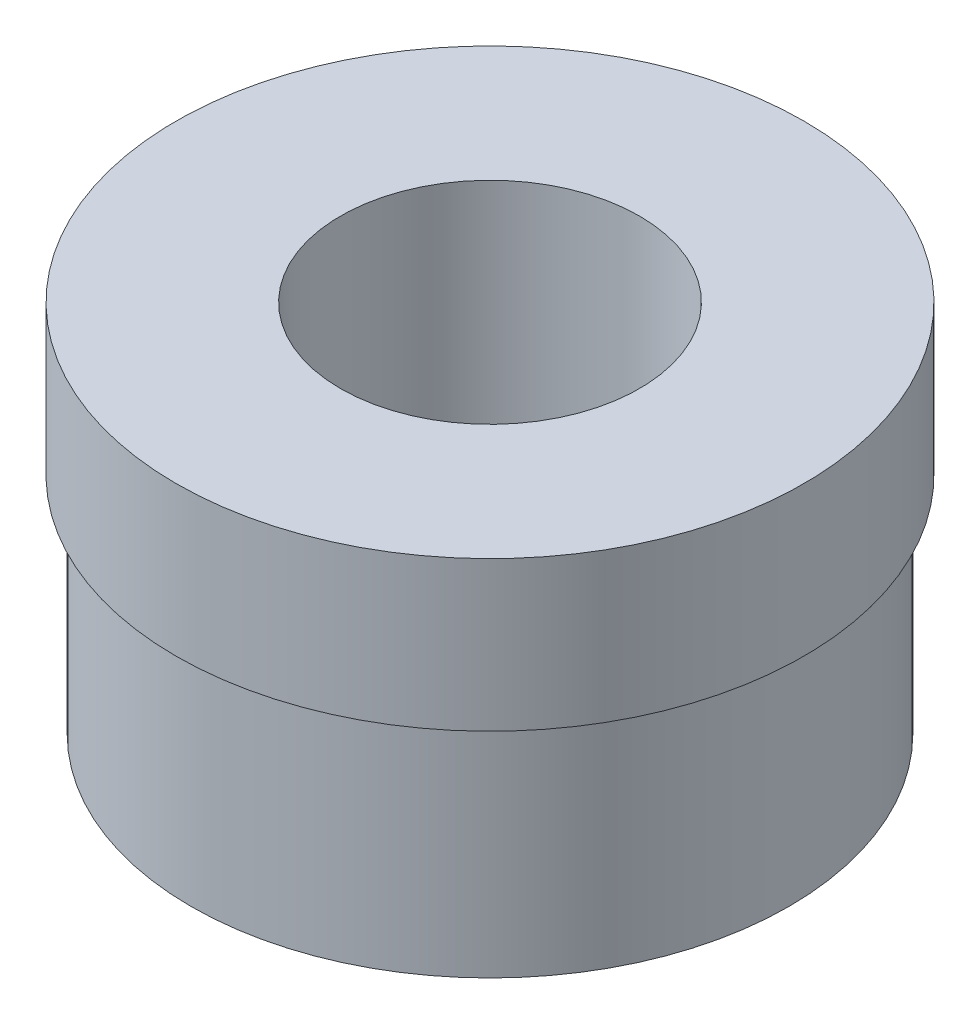
ISO-10303-21;
HEADER;
FILE_DESCRIPTION(('STEP AP214'),'2;1');
FILE_NAME('part.step','',(''),(''),'','','');
FILE_SCHEMA(('AUTOMOTIVE_DESIGN { 1 0 10303 214 1 1 1 1 }'));
ENDSEC;
DATA;
#1=APPLICATION_CONTEXT('core data for automotive mechanical design processes');
#2=APPLICATION_PROTOCOL_DEFINITION('international standard','automotive_design',2000,#1);
#3=PRODUCT_CONTEXT('',#1,'mechanical');
#4=PRODUCT('Part','Part','',(#3));
#5=PRODUCT_RELATED_PRODUCT_CATEGORY('part','',(#4));
#6=PRODUCT_DEFINITION_FORMATION('','',#4);
#7=PRODUCT_DEFINITION_CONTEXT('part definition',#1,'design');
#8=PRODUCT_DEFINITION('design','',#6,#7);
#9=PRODUCT_DEFINITION_SHAPE('','',#8);
#10=(LENGTH_UNIT() NAMED_UNIT(*) SI_UNIT(.MILLI.,.METRE.));
#11=(NAMED_UNIT(*) PLANE_ANGLE_UNIT() SI_UNIT($,.RADIAN.));
#12=(NAMED_UNIT(*) SI_UNIT($,.STERADIAN.) SOLID_ANGLE_UNIT());
#13=UNCERTAINTY_MEASURE_WITH_UNIT(LENGTH_MEASURE(1.E-05),#10,'distance_accuracy_value','');
#14=(GEOMETRIC_REPRESENTATION_CONTEXT(3) GLOBAL_UNCERTAINTY_ASSIGNED_CONTEXT((#13)) GLOBAL_UNIT_ASSIGNED_CONTEXT((#10,
#11,#12)) REPRESENTATION_CONTEXT('',''));
#15=CARTESIAN_POINT('',(0.,0.,0.));
#16=DIRECTION('',(0.,0.,1.));
#17=DIRECTION('',(1.,0.,0.));
#18=AXIS2_PLACEMENT_3D('',#15,#16,#17);
#19=CARTESIAN_POINT('',(20.,0.,0.));
#20=DIRECTION('',(0.,1.,0.));
#21=DIRECTION('',(0.,0.,1.));
#22=AXIS2_PLACEMENT_3D('',#19,#20,#21);
#23=PLANE('',#22);
#24=CARTESIAN_POINT('',(0.,0.,0.));
#25=DIRECTION('',(0.,1.,0.));
#26=DIRECTION('',(0.,0.,1.));
#27=AXIS2_PLACEMENT_3D('',#24,#25,#26);
#28=CIRCLE('',#27,20.);
#29=CARTESIAN_POINT('',(0.,0.,20.));
#30=VERTEX_POINT('',#29);
#31=EDGE_CURVE('E63',#30,#30,#28,.T.);
#32=ORIENTED_EDGE('',*,*,#31,.F.);
#33=EDGE_LOOP('',(#32));
#34=FACE_BOUND('',#33,.T.);
#35=CARTESIAN_POINT('',(0.,0.,0.));
#36=DIRECTION('',(0.,1.,0.));
#37=DIRECTION('',(0.,0.,1.));
#38=AXIS2_PLACEMENT_3D('',#35,#36,#37);
#39=CIRCLE('',#38,10.);
#40=CARTESIAN_POINT('',(0.,0.,10.));
#41=VERTEX_POINT('',#40);
#42=EDGE_CURVE('E10',#41,#41,#39,.T.);
#43=ORIENTED_EDGE('',*,*,#42,.T.);
#44=EDGE_LOOP('',(#43));
#45=FACE_BOUND('',#44,.T.);
#46=ADVANCED_FACE('F41',(#34,#45),#23,.F.);
#47=CARTESIAN_POINT('',(0.,61.8348623853211,0.));
#48=DIRECTION('',(0.,1.,0.));
#49=DIRECTION('',(0.,0.,1.));
#50=AXIS2_PLACEMENT_3D('',#47,#48,#49);
#51=CYLINDRICAL_SURFACE('',#50,10.);
#52=ORIENTED_EDGE('',*,*,#42,.F.);
#53=EDGE_LOOP('',(#52));
#54=FACE_BOUND('',#53,.T.);
#55=CARTESIAN_POINT('',(0.,25.,0.));
#56=DIRECTION('',(0.,1.,0.));
#57=DIRECTION('',(0.,0.,1.));
#58=AXIS2_PLACEMENT_3D('',#55,#56,#57);
#59=CIRCLE('',#58,10.);
#60=CARTESIAN_POINT('',(0.,25.,10.));
#61=VERTEX_POINT('',#60);
#62=EDGE_CURVE('E47',#61,#61,#59,.T.);
#63=ORIENTED_EDGE('',*,*,#62,.T.);
#64=EDGE_LOOP('',(#63));
#65=FACE_BOUND('',#64,.T.);
#66=ADVANCED_FACE('F70',(#54,#65),#51,.F.);
#67=CARTESIAN_POINT('',(10.,25.,0.));
#68=DIRECTION('',(0.,-1.,0.));
#69=DIRECTION('',(0.,0.,-1.));
#70=AXIS2_PLACEMENT_3D('',#67,#68,#69);
#71=PLANE('',#70);
#72=ORIENTED_EDGE('',*,*,#62,.F.);
#73=EDGE_LOOP('',(#72));
#74=FACE_BOUND('',#73,.T.);
#75=CARTESIAN_POINT('',(0.,25.,0.));
#76=DIRECTION('',(0.,1.,0.));
#77=DIRECTION('',(0.,0.,1.));
#78=AXIS2_PLACEMENT_3D('',#75,#76,#77);
#79=CIRCLE('',#78,21.);
#80=CARTESIAN_POINT('',(0.,25.,21.));
#81=VERTEX_POINT('',#80);
#82=EDGE_CURVE('E51',#81,#81,#79,.T.);
#83=ORIENTED_EDGE('',*,*,#82,.T.);
#84=EDGE_LOOP('',(#83));
#85=FACE_BOUND('',#84,.T.);
#86=ADVANCED_FACE('F74',(#74,#85),#71,.F.);
#87=CARTESIAN_POINT('',(0.,61.8348623853211,0.));
#88=DIRECTION('',(0.,1.,0.));
#89=DIRECTION('',(0.,0.,1.));
#90=AXIS2_PLACEMENT_3D('',#87,#88,#89);
#91=CYLINDRICAL_SURFACE('',#90,21.);
#92=ORIENTED_EDGE('',*,*,#82,.F.);
#93=EDGE_LOOP('',(#92));
#94=FACE_BOUND('',#93,.T.);
#95=CARTESIAN_POINT('',(0.,15.,0.));
#96=DIRECTION('',(0.,1.,0.));
#97=DIRECTION('',(0.,0.,1.));
#98=AXIS2_PLACEMENT_3D('',#95,#96,#97);
#99=CIRCLE('',#98,21.);
#100=CARTESIAN_POINT('',(0.,15.,21.));
#101=VERTEX_POINT('',#100);
#102=EDGE_CURVE('E55',#101,#101,#99,.T.);
#103=ORIENTED_EDGE('',*,*,#102,.T.);
#104=EDGE_LOOP('',(#103));
#105=FACE_BOUND('',#104,.T.);
#106=ADVANCED_FACE('F79',(#94,#105),#91,.T.);
#107=CARTESIAN_POINT('',(21.,15.,0.));
#108=DIRECTION('',(0.,1.,0.));
#109=DIRECTION('',(0.,0.,1.));
#110=AXIS2_PLACEMENT_3D('',#107,#108,#109);
#111=PLANE('',#110);
#112=ORIENTED_EDGE('',*,*,#102,.F.);
#113=EDGE_LOOP('',(#112));
#114=FACE_BOUND('',#113,.T.);
#115=CARTESIAN_POINT('',(0.,15.,0.));
#116=DIRECTION('',(0.,1.,0.));
#117=DIRECTION('',(0.,0.,1.));
#118=AXIS2_PLACEMENT_3D('',#115,#116,#117);
#119=CIRCLE('',#118,20.);
#120=CARTESIAN_POINT('',(0.,15.,20.));
#121=VERTEX_POINT('',#120);
#122=EDGE_CURVE('E60',#121,#121,#119,.T.);
#123=ORIENTED_EDGE('',*,*,#122,.T.);
#124=EDGE_LOOP('',(#123));
#125=FACE_BOUND('',#124,.T.);
#126=ADVANCED_FACE('F85',(#114,#125),#111,.F.);
#127=CARTESIAN_POINT('',(0.,61.8348623853211,0.));
#128=DIRECTION('',(0.,1.,0.));
#129=DIRECTION('',(0.,0.,1.));
#130=AXIS2_PLACEMENT_3D('',#127,#128,#129);
#131=CYLINDRICAL_SURFACE('',#130,20.);
#132=ORIENTED_EDGE('',*,*,#122,.F.);
#133=EDGE_LOOP('',(#132));
#134=FACE_BOUND('',#133,.T.);
#135=ORIENTED_EDGE('',*,*,#31,.T.);
#136=EDGE_LOOP('',(#135));
#137=FACE_BOUND('',#136,.T.);
#138=ADVANCED_FACE('F67',(#134,#137),#131,.T.);
#139=CLOSED_SHELL('',(#46,#66,#86,#106,#126,#138));
#140=MANIFOLD_SOLID_BREP('B2',#139);
#141=ADVANCED_BREP_SHAPE_REPRESENTATION('',(#18,#140),#14);
#142=SHAPE_DEFINITION_REPRESENTATION(#9,#141);
ENDSEC;
END-ISO-10303-21;
